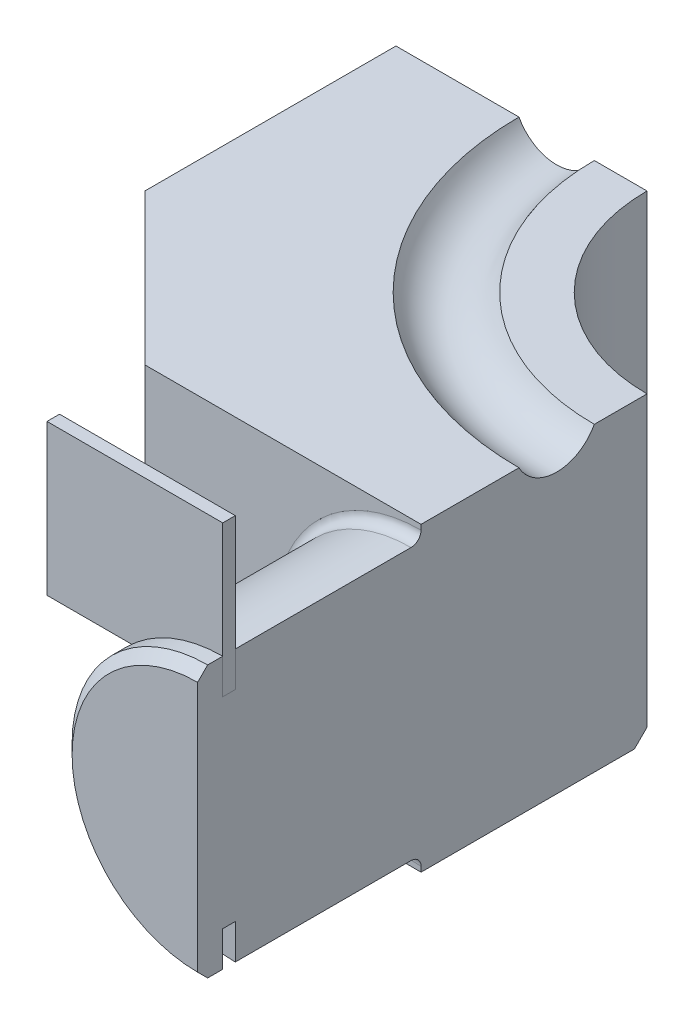
ISO-10303-21;
HEADER;
FILE_DESCRIPTION(('STEP AP214'),'2;1');
FILE_NAME('part.step','',(''),(''),'','','');
FILE_SCHEMA(('AUTOMOTIVE_DESIGN { 1 0 10303 214 1 1 1 1 }'));
ENDSEC;
DATA;
#1=APPLICATION_CONTEXT('core data for automotive mechanical design processes');
#2=APPLICATION_PROTOCOL_DEFINITION('international standard','automotive_design',2000,#1);
#3=PRODUCT_CONTEXT('',#1,'mechanical');
#4=PRODUCT('Part','Part','',(#3));
#5=PRODUCT_RELATED_PRODUCT_CATEGORY('part','',(#4));
#6=PRODUCT_DEFINITION_FORMATION('','',#4);
#7=PRODUCT_DEFINITION_CONTEXT('part definition',#1,'design');
#8=PRODUCT_DEFINITION('design','',#6,#7);
#9=PRODUCT_DEFINITION_SHAPE('','',#8);
#10=(LENGTH_UNIT() NAMED_UNIT(*) SI_UNIT(.MILLI.,.METRE.));
#11=(NAMED_UNIT(*) PLANE_ANGLE_UNIT() SI_UNIT($,.RADIAN.));
#12=(NAMED_UNIT(*) SI_UNIT($,.STERADIAN.) SOLID_ANGLE_UNIT());
#13=UNCERTAINTY_MEASURE_WITH_UNIT(LENGTH_MEASURE(1.E-05),#10,'distance_accuracy_value','');
#14=(GEOMETRIC_REPRESENTATION_CONTEXT(3) GLOBAL_UNCERTAINTY_ASSIGNED_CONTEXT((#13)) GLOBAL_UNIT_ASSIGNED_CONTEXT((#10,
#11,#12)) REPRESENTATION_CONTEXT('',''));
#15=CARTESIAN_POINT('',(0.,0.,0.));
#16=DIRECTION('',(0.,0.,1.));
#17=DIRECTION('',(1.,0.,0.));
#18=AXIS2_PLACEMENT_3D('',#15,#16,#17);
#19=CARTESIAN_POINT('',(0.,100.,239.));
#20=DIRECTION('',(0.,1.,0.));
#21=DIRECTION('',(0.,0.,1.));
#22=AXIS2_PLACEMENT_3D('',#19,#20,#21);
#23=PLANE('',#22);
#24=DIRECTION('',(1.,0.,0.));
#25=VECTOR('',#24,1.);
#26=CARTESIAN_POINT('',(0.,100.,234.));
#27=LINE('',#26,#25);
#28=CARTESIAN_POINT('',(-70.0000000000001,100.,234.));
#29=VERTEX_POINT('',#28);
#30=CARTESIAN_POINT('',(0.,100.,234.));
#31=VERTEX_POINT('',#30);
#32=EDGE_CURVE('E99',#29,#31,#27,.T.);
#33=ORIENTED_EDGE('',*,*,#32,.T.);
#34=DIRECTION('',(0.,0.,1.));
#35=VECTOR('',#34,1.);
#36=CARTESIAN_POINT('',(0.,100.,239.));
#37=LINE('',#36,#35);
#38=CARTESIAN_POINT('',(0.,100.,239.));
#39=VERTEX_POINT('',#38);
#40=EDGE_CURVE('E67',#31,#39,#37,.T.);
#41=ORIENTED_EDGE('',*,*,#40,.T.);
#42=DIRECTION('',(1.,0.,0.));
#43=VECTOR('',#42,1.);
#44=CARTESIAN_POINT('',(0.,100.,239.));
#45=LINE('',#44,#43);
#46=CARTESIAN_POINT('',(-70.0000000000001,100.,239.));
#47=VERTEX_POINT('',#46);
#48=EDGE_CURVE('E98',#47,#39,#45,.T.);
#49=ORIENTED_EDGE('',*,*,#48,.F.);
#50=DIRECTION('',(0.,0.,-1.));
#51=VECTOR('',#50,1.);
#52=CARTESIAN_POINT('',(-70.0000000000001,100.,239.));
#53=LINE('',#52,#51);
#54=EDGE_CURVE('E107',#47,#29,#53,.T.);
#55=ORIENTED_EDGE('',*,*,#54,.T.);
#56=EDGE_LOOP('',(#33,#41,#49,#55));
#57=FACE_BOUND('',#56,.T.);
#58=ADVANCED_FACE('F53',(#57),#23,.F.);
#59=CARTESIAN_POINT('',(0.,160.,239.));
#60=DIRECTION('',(0.,-1.,0.));
#61=DIRECTION('',(0.,0.,-1.));
#62=AXIS2_PLACEMENT_3D('',#59,#60,#61);
#63=PLANE('',#62);
#64=DIRECTION('',(-1.,0.,0.));
#65=VECTOR('',#64,1.);
#66=CARTESIAN_POINT('',(0.,160.,239.));
#67=LINE('',#66,#65);
#68=CARTESIAN_POINT('',(0.,160.,239.));
#69=VERTEX_POINT('',#68);
#70=CARTESIAN_POINT('',(-70.0000000000001,160.,239.));
#71=VERTEX_POINT('',#70);
#72=EDGE_CURVE('E60',#69,#71,#67,.T.);
#73=ORIENTED_EDGE('',*,*,#72,.F.);
#74=DIRECTION('',(0.,0.,-1.));
#75=VECTOR('',#74,1.);
#76=CARTESIAN_POINT('',(0.,160.,239.));
#77=LINE('',#76,#75);
#78=CARTESIAN_POINT('',(0.,160.,234.));
#79=VERTEX_POINT('',#78);
#80=EDGE_CURVE('E95',#69,#79,#77,.T.);
#81=ORIENTED_EDGE('',*,*,#80,.T.);
#82=DIRECTION('',(-1.,0.,0.));
#83=VECTOR('',#82,1.);
#84=CARTESIAN_POINT('',(0.,160.,234.));
#85=LINE('',#84,#83);
#86=CARTESIAN_POINT('',(-70.0000000000001,160.,234.));
#87=VERTEX_POINT('',#86);
#88=EDGE_CURVE('E88',#79,#87,#85,.T.);
#89=ORIENTED_EDGE('',*,*,#88,.T.);
#90=DIRECTION('',(0.,0.,-1.));
#91=VECTOR('',#90,1.);
#92=CARTESIAN_POINT('',(-70.0000000000001,160.,239.));
#93=LINE('',#92,#91);
#94=EDGE_CURVE('E91',#71,#87,#93,.T.);
#95=ORIENTED_EDGE('',*,*,#94,.F.);
#96=EDGE_LOOP('',(#73,#81,#89,#95));
#97=FACE_BOUND('',#96,.T.);
#98=ADVANCED_FACE('F90',(#97),#63,.F.);
#99=CARTESIAN_POINT('',(0.,0.,239.));
#100=DIRECTION('',(0.,0.,1.));
#101=DIRECTION('',(1.,0.,0.));
#102=AXIS2_PLACEMENT_3D('',#99,#100,#101);
#103=PLANE('',#102);
#104=DIRECTION('',(0.,-1.,0.));
#105=VECTOR('',#104,1.);
#106=CARTESIAN_POINT('',(0.,0.,239.));
#107=LINE('',#106,#105);
#108=EDGE_CURVE('E111',#69,#39,#107,.T.);
#109=ORIENTED_EDGE('',*,*,#108,.F.);
#110=ORIENTED_EDGE('',*,*,#72,.T.);
#111=DIRECTION('',(0.,1.,0.));
#112=VECTOR('',#111,1.);
#113=CARTESIAN_POINT('',(-70.0000000000001,160.,239.));
#114=LINE('',#113,#112);
#115=EDGE_CURVE('E106',#47,#71,#114,.T.);
#116=ORIENTED_EDGE('',*,*,#115,.F.);
#117=ORIENTED_EDGE('',*,*,#48,.T.);
#118=EDGE_LOOP('',(#109,#110,#116,#117));
#119=FACE_BOUND('',#118,.T.);
#120=ADVANCED_FACE('F121',(#119),#103,.T.);
#121=CARTESIAN_POINT('',(0.,0.,234.));
#122=DIRECTION('',(0.,0.,1.));
#123=DIRECTION('',(1.,0.,0.));
#124=AXIS2_PLACEMENT_3D('',#121,#122,#123);
#125=PLANE('',#124);
#126=ORIENTED_EDGE('',*,*,#88,.F.);
#127=DIRECTION('',(0.,-1.,0.));
#128=VECTOR('',#127,1.);
#129=CARTESIAN_POINT('',(0.,0.,234.));
#130=LINE('',#129,#128);
#131=EDGE_CURVE('E12',#79,#31,#130,.T.);
#132=ORIENTED_EDGE('',*,*,#131,.T.);
#133=ORIENTED_EDGE('',*,*,#32,.F.);
#134=DIRECTION('',(0.,1.,0.));
#135=VECTOR('',#134,1.);
#136=CARTESIAN_POINT('',(-70.0000000000001,160.,234.));
#137=LINE('',#136,#135);
#138=EDGE_CURVE('E104',#29,#87,#137,.T.);
#139=ORIENTED_EDGE('',*,*,#138,.T.);
#140=EDGE_LOOP('',(#126,#132,#133,#139));
#141=FACE_BOUND('',#140,.T.);
#142=ADVANCED_FACE('F109',(#141),#125,.F.);
#143=CARTESIAN_POINT('',(-70.0000000000001,160.,239.));
#144=DIRECTION('',(1.,0.,0.));
#145=DIRECTION('',(0.,-1.,0.));
#146=AXIS2_PLACEMENT_3D('',#143,#144,#145);
#147=PLANE('',#146);
#148=ORIENTED_EDGE('',*,*,#138,.F.);
#149=ORIENTED_EDGE('',*,*,#54,.F.);
#150=ORIENTED_EDGE('',*,*,#115,.T.);
#151=ORIENTED_EDGE('',*,*,#94,.T.);
#152=EDGE_LOOP('',(#148,#149,#150,#151));
#153=FACE_BOUND('',#152,.T.);
#154=ADVANCED_FACE('F102',(#153),#147,.F.);
#155=CARTESIAN_POINT('',(0.,209.166309537636,116.));
#156=DIRECTION('',(-1.,0.,0.));
#157=DIRECTION('',(0.,-1.,0.));
#158=AXIS2_PLACEMENT_3D('',#155,#156,#157);
#159=PLANE('',#158);
#160=ORIENTED_EDGE('',*,*,#108,.T.);
#161=ORIENTED_EDGE('',*,*,#40,.F.);
#162=ORIENTED_EDGE('',*,*,#131,.F.);
#163=ORIENTED_EDGE('',*,*,#80,.F.);
#164=EDGE_LOOP('',(#160,#161,#162,#163));
#165=FACE_BOUND('',#164,.T.);
#166=ADVANCED_FACE('F159',(#165),#159,.F.);
#167=CLOSED_SHELL('',(#58,#98,#120,#142,#154,#166));
#168=MANIFOLD_SOLID_BREP('B2',#167);
#169=CARTESIAN_POINT('',(0.,120.,0.));
#170=DIRECTION('',(0.,1.,0.));
#171=DIRECTION('',(0.,0.,1.));
#172=AXIS2_PLACEMENT_3D('',#169,#170,#171);
#173=PLANE('',#172);
#174=CARTESIAN_POINT('',(0.,120.,0.));
#175=DIRECTION('',(0.,1.,0.));
#176=DIRECTION('',(0.,0.,1.));
#177=AXIS2_PLACEMENT_3D('',#174,#175,#176);
#178=CIRCLE('',#177,121.);
#179=CARTESIAN_POINT('',(0.,120.,121.));
#180=VERTEX_POINT('',#179);
#181=CARTESIAN_POINT('',(-121.,120.,0.));
#182=VERTEX_POINT('',#181);
#183=EDGE_CURVE('E355',#180,#182,#178,.F.);
#184=ORIENTED_EDGE('',*,*,#183,.T.);
#185=DIRECTION('',(-1.,0.,0.));
#186=VECTOR('',#185,1.);
#187=CARTESIAN_POINT('',(0.,120.,0.));
#188=LINE('',#187,#186);
#189=CARTESIAN_POINT('',(-170.,120.,0.));
#190=VERTEX_POINT('',#189);
#191=EDGE_CURVE('E217',#182,#190,#188,.T.);
#192=ORIENTED_EDGE('',*,*,#191,.T.);
#193=DIRECTION('',(0.,0.,1.));
#194=VECTOR('',#193,1.);
#195=CARTESIAN_POINT('',(-170.,120.,-100.000000000001));
#196=LINE('',#195,#194);
#197=CARTESIAN_POINT('',(-170.,120.,100.000000000001));
#198=VERTEX_POINT('',#197);
#199=EDGE_CURVE('E397',#190,#198,#196,.T.);
#200=ORIENTED_EDGE('',*,*,#199,.T.);
#201=DIRECTION('',(0.707106781186552,0.,0.707106781186544));
#202=VECTOR('',#201,1.);
#203=CARTESIAN_POINT('',(-110.,120.,160.));
#204=LINE('',#203,#202);
#205=CARTESIAN_POINT('',(-110.,120.,160.));
#206=VERTEX_POINT('',#205);
#207=EDGE_CURVE('E399',#198,#206,#204,.T.);
#208=ORIENTED_EDGE('',*,*,#207,.T.);
#209=DIRECTION('',(1.,0.,0.));
#210=VECTOR('',#209,1.);
#211=CARTESIAN_POINT('',(-110.,120.,160.));
#212=LINE('',#211,#210);
#213=CARTESIAN_POINT('',(0.,120.,160.));
#214=VERTEX_POINT('',#213);
#215=EDGE_CURVE('E402',#206,#214,#212,.T.);
#216=ORIENTED_EDGE('',*,*,#215,.T.);
#217=DIRECTION('',(0.,0.,-1.));
#218=VECTOR('',#217,1.);
#219=CARTESIAN_POINT('',(0.,120.,0.));
#220=LINE('',#219,#218);
#221=EDGE_CURVE('E647',#214,#180,#220,.T.);
#222=ORIENTED_EDGE('',*,*,#221,.T.);
#223=EDGE_LOOP('',(#184,#192,#200,#208,#216,#222));
#224=FACE_BOUND('',#223,.T.);
#225=ADVANCED_FACE('F189',(#224),#173,.T.);
#226=CARTESIAN_POINT('',(0.,120.,0.));
#227=DIRECTION('',(0.,1.,0.));
#228=DIRECTION('',(0.,0.,1.));
#229=AXIS2_PLACEMENT_3D('',#226,#227,#228);
#230=CIRCLE('',#229,70.);
#231=CARTESIAN_POINT('',(-70.,120.,0.));
#232=VERTEX_POINT('',#231);
#233=CARTESIAN_POINT('',(0.,120.,70.));
#234=VERTEX_POINT('',#233);
#235=EDGE_CURVE('E370',#232,#234,#230,.T.);
#236=ORIENTED_EDGE('',*,*,#235,.F.);
#237=DIRECTION('',(-1.,0.,0.));
#238=VECTOR('',#237,1.);
#239=CARTESIAN_POINT('',(0.,120.,0.));
#240=LINE('',#239,#238);
#241=CARTESIAN_POINT('',(-91.,120.,0.));
#242=VERTEX_POINT('',#241);
#243=EDGE_CURVE('E369',#232,#242,#240,.T.);
#244=ORIENTED_EDGE('',*,*,#243,.T.);
#245=CARTESIAN_POINT('',(0.,120.,0.));
#246=DIRECTION('',(0.,-1.,0.));
#247=DIRECTION('',(0.,0.,-1.));
#248=AXIS2_PLACEMENT_3D('',#245,#246,#247);
#249=CIRCLE('',#248,91.);
#250=CARTESIAN_POINT('',(0.,120.,91.));
#251=VERTEX_POINT('',#250);
#252=EDGE_CURVE('E352',#242,#251,#249,.F.);
#253=ORIENTED_EDGE('',*,*,#252,.T.);
#254=DIRECTION('',(0.,0.,-1.));
#255=VECTOR('',#254,1.);
#256=CARTESIAN_POINT('',(0.,120.,0.));
#257=LINE('',#256,#255);
#258=EDGE_CURVE('E207',#251,#234,#257,.T.);
#259=ORIENTED_EDGE('',*,*,#258,.T.);
#260=EDGE_LOOP('',(#236,#244,#253,#259));
#261=FACE_BOUND('',#260,.T.);
#262=ADVANCED_FACE('F367',(#261),#173,.T.);
#263=CARTESIAN_POINT('',(-170.,120.,-100.000000000001));
#264=DIRECTION('',(1.,0.,0.));
#265=DIRECTION('',(0.,0.,-1.));
#266=AXIS2_PLACEMENT_3D('',#263,#264,#265);
#267=PLANE('',#266);
#268=DIRECTION('',(0.,1.,0.));
#269=VECTOR('',#268,1.);
#270=CARTESIAN_POINT('',(-170.,120.,0.));
#271=LINE('',#270,#269);
#272=CARTESIAN_POINT('',(-170.,0.,0.));
#273=VERTEX_POINT('',#272);
#274=EDGE_CURVE('E381',#273,#190,#271,.T.);
#275=ORIENTED_EDGE('',*,*,#274,.F.);
#276=DIRECTION('',(0.,0.,1.));
#277=VECTOR('',#276,1.);
#278=CARTESIAN_POINT('',(-170.,0.,-100.000000000001));
#279=LINE('',#278,#277);
#280=CARTESIAN_POINT('',(-170.,0.,100.000000000001));
#281=VERTEX_POINT('',#280);
#282=EDGE_CURVE('E396',#273,#281,#279,.T.);
#283=ORIENTED_EDGE('',*,*,#282,.T.);
#284=DIRECTION('',(0.,-1.,0.));
#285=VECTOR('',#284,1.);
#286=CARTESIAN_POINT('',(-170.,120.,100.000000000001));
#287=LINE('',#286,#285);
#288=EDGE_CURVE('E412',#198,#281,#287,.T.);
#289=ORIENTED_EDGE('',*,*,#288,.F.);
#290=ORIENTED_EDGE('',*,*,#199,.F.);
#291=EDGE_LOOP('',(#275,#283,#289,#290));
#292=FACE_BOUND('',#291,.T.);
#293=ADVANCED_FACE('F502',(#292),#267,.F.);
#294=CARTESIAN_POINT('',(-110.,120.,160.));
#295=DIRECTION('',(0.,0.,-1.));
#296=DIRECTION('',(-1.,0.,0.));
#297=AXIS2_PLACEMENT_3D('',#294,#295,#296);
#298=PLANE('',#297);
#299=DIRECTION('',(0.,-1.,0.));
#300=VECTOR('',#299,1.);
#301=CARTESIAN_POINT('',(0.,120.,160.));
#302=LINE('',#301,#300);
#303=CARTESIAN_POINT('',(0.,118.,160.));
#304=VERTEX_POINT('',#303);
#305=EDGE_CURVE('E339',#214,#304,#302,.T.);
#306=ORIENTED_EDGE('',*,*,#305,.F.);
#307=ORIENTED_EDGE('',*,*,#215,.F.);
#308=DIRECTION('',(0.,-1.,0.));
#309=VECTOR('',#308,1.);
#310=CARTESIAN_POINT('',(-110.,120.,160.));
#311=LINE('',#310,#309);
#312=CARTESIAN_POINT('',(-110.,0.,160.));
#313=VERTEX_POINT('',#312);
#314=EDGE_CURVE('E405',#206,#313,#311,.T.);
#315=ORIENTED_EDGE('',*,*,#314,.T.);
#316=DIRECTION('',(1.,0.,0.));
#317=VECTOR('',#316,1.);
#318=CARTESIAN_POINT('',(-110.,0.,160.));
#319=LINE('',#318,#317);
#320=CARTESIAN_POINT('',(0.,0.,160.));
#321=VERTEX_POINT('',#320);
#322=EDGE_CURVE('E400',#313,#321,#319,.T.);
#323=ORIENTED_EDGE('',*,*,#322,.T.);
#324=CARTESIAN_POINT('',(0.,2.,160.));
#325=VERTEX_POINT('',#324);
#326=EDGE_CURVE('E324',#325,#321,#302,.T.);
#327=ORIENTED_EDGE('',*,*,#326,.F.);
#328=CARTESIAN_POINT('',(0.,60.,160.));
#329=DIRECTION('',(0.,0.,-1.));
#330=DIRECTION('',(-1.,0.,0.));
#331=AXIS2_PLACEMENT_3D('',#328,#329,#330);
#332=CIRCLE('',#331,58.);
#333=EDGE_CURVE('E348',#325,#304,#332,.T.);
#334=ORIENTED_EDGE('',*,*,#333,.T.);
#335=EDGE_LOOP('',(#306,#307,#315,#323,#327,#334));
#336=FACE_BOUND('',#335,.T.);
#337=ADVANCED_FACE('F424',(#336),#298,.F.);
#338=CARTESIAN_POINT('',(0.,0.,0.));
#339=DIRECTION('',(0.,1.,0.));
#340=DIRECTION('',(0.,0.,1.));
#341=AXIS2_PLACEMENT_3D('',#338,#339,#340);
#342=PLANE('',#341);
#343=DIRECTION('',(1.,0.,0.));
#344=VECTOR('',#343,1.);
#345=CARTESIAN_POINT('',(-270.447334936307,0.,0.));
#346=LINE('',#345,#344);
#347=CARTESIAN_POINT('',(-75.0000000000001,0.,0.));
#348=VERTEX_POINT('',#347);
#349=EDGE_CURVE('E329',#273,#348,#346,.T.);
#350=ORIENTED_EDGE('',*,*,#349,.T.);
#351=CARTESIAN_POINT('',(0.,0.,0.));
#352=DIRECTION('',(0.,1.,0.));
#353=DIRECTION('',(0.,0.,1.));
#354=AXIS2_PLACEMENT_3D('',#351,#352,#353);
#355=CIRCLE('',#354,75.0000000000001);
#356=CARTESIAN_POINT('',(0.,0.,75.0000000000002));
#357=VERTEX_POINT('',#356);
#358=EDGE_CURVE('E335',#348,#357,#355,.T.);
#359=ORIENTED_EDGE('',*,*,#358,.T.);
#360=DIRECTION('',(0.,0.,1.));
#361=VECTOR('',#360,1.);
#362=CARTESIAN_POINT('',(0.,0.,331.159639247816));
#363=LINE('',#362,#361);
#364=EDGE_CURVE('E318',#357,#321,#363,.T.);
#365=ORIENTED_EDGE('',*,*,#364,.T.);
#366=ORIENTED_EDGE('',*,*,#322,.F.);
#367=DIRECTION('',(0.707106781186552,0.,0.707106781186544));
#368=VECTOR('',#367,1.);
#369=CARTESIAN_POINT('',(-110.,0.,160.));
#370=LINE('',#369,#368);
#371=EDGE_CURVE('E407',#281,#313,#370,.T.);
#372=ORIENTED_EDGE('',*,*,#371,.F.);
#373=ORIENTED_EDGE('',*,*,#282,.F.);
#374=EDGE_LOOP('',(#350,#359,#365,#366,#372,#373));
#375=FACE_BOUND('',#374,.T.);
#376=ADVANCED_FACE('F342',(#375),#342,.F.);
#377=CARTESIAN_POINT('',(0.,120.,0.));
#378=DIRECTION('',(0.,-1.,0.));
#379=DIRECTION('',(0.,0.,-1.));
#380=AXIS2_PLACEMENT_3D('',#377,#378,#379);
#381=CYLINDRICAL_SURFACE('',#380,70.);
#382=CARTESIAN_POINT('',(0.,5.00000000000006,0.));
#383=DIRECTION('',(0.,1.,0.));
#384=DIRECTION('',(0.,0.,1.));
#385=AXIS2_PLACEMENT_3D('',#382,#383,#384);
#386=CIRCLE('',#385,70.);
#387=CARTESIAN_POINT('',(0.,5.00000000000006,70.));
#388=VERTEX_POINT('',#387);
#389=CARTESIAN_POINT('',(-70.,5.00000000000006,0.));
#390=VERTEX_POINT('',#389);
#391=EDGE_CURVE('E337',#388,#390,#386,.F.);
#392=ORIENTED_EDGE('',*,*,#391,.T.);
#393=DIRECTION('',(0.,-1.,0.));
#394=VECTOR('',#393,1.);
#395=CARTESIAN_POINT('',(-70.,120.,0.));
#396=LINE('',#395,#394);
#397=EDGE_CURVE('E373',#390,#232,#396,.F.);
#398=ORIENTED_EDGE('',*,*,#397,.T.);
#399=ORIENTED_EDGE('',*,*,#235,.T.);
#400=DIRECTION('',(0.,-1.,0.));
#401=VECTOR('',#400,1.);
#402=CARTESIAN_POINT('',(0.,120.,70.));
#403=LINE('',#402,#401);
#404=EDGE_CURVE('E646',#234,#388,#403,.T.);
#405=ORIENTED_EDGE('',*,*,#404,.T.);
#406=EDGE_LOOP('',(#392,#398,#399,#405));
#407=FACE_BOUND('',#406,.T.);
#408=ADVANCED_FACE('F505',(#407),#381,.F.);
#409=CARTESIAN_POINT('',(0.,60.,234.));
#410=DIRECTION('',(0.,0.,-1.));
#411=DIRECTION('',(-1.,0.,0.));
#412=AXIS2_PLACEMENT_3D('',#409,#410,#411);
#413=CYLINDRICAL_SURFACE('',#412,54.);
#414=CARTESIAN_POINT('',(0.,60.,164.));
#415=DIRECTION('',(0.,0.,-1.));
#416=DIRECTION('',(-1.,0.,0.));
#417=AXIS2_PLACEMENT_3D('',#414,#415,#416);
#418=CIRCLE('',#417,54.);
#419=CARTESIAN_POINT('',(0.,114.,164.));
#420=VERTEX_POINT('',#419);
#421=CARTESIAN_POINT('',(0.,6.,164.));
#422=VERTEX_POINT('',#421);
#423=EDGE_CURVE('E344',#420,#422,#418,.F.);
#424=ORIENTED_EDGE('',*,*,#423,.T.);
#425=DIRECTION('',(0.,0.,-1.));
#426=VECTOR('',#425,1.);
#427=CARTESIAN_POINT('',(0.,6.,234.));
#428=LINE('',#427,#426);
#429=CARTESIAN_POINT('',(0.,6.,234.));
#430=VERTEX_POINT('',#429);
#431=EDGE_CURVE('E462',#422,#430,#428,.F.);
#432=ORIENTED_EDGE('',*,*,#431,.T.);
#433=CARTESIAN_POINT('',(0.,60.,234.));
#434=DIRECTION('',(0.,0.,-1.));
#435=DIRECTION('',(-1.,0.,0.));
#436=AXIS2_PLACEMENT_3D('',#433,#434,#435);
#437=CIRCLE('',#436,54.);
#438=CARTESIAN_POINT('',(0.,114.,234.));
#439=VERTEX_POINT('',#438);
#440=EDGE_CURVE('E392',#430,#439,#437,.T.);
#441=ORIENTED_EDGE('',*,*,#440,.T.);
#442=DIRECTION('',(0.,0.,-1.));
#443=VECTOR('',#442,1.);
#444=CARTESIAN_POINT('',(0.,114.,234.));
#445=LINE('',#444,#443);
#446=EDGE_CURVE('E432',#439,#420,#445,.T.);
#447=ORIENTED_EDGE('',*,*,#446,.T.);
#448=EDGE_LOOP('',(#424,#432,#441,#447));
#449=FACE_BOUND('',#448,.T.);
#450=ADVANCED_FACE('F578',(#449),#413,.T.);
#451=CARTESIAN_POINT('',(0.,60.,234.));
#452=DIRECTION('',(0.,0.,-1.));
#453=DIRECTION('',(-1.,0.,0.));
#454=AXIS2_PLACEMENT_3D('',#451,#452,#453);
#455=PLANE('',#454);
#456=DIRECTION('',(0.,-1.,0.));
#457=VECTOR('',#456,1.);
#458=CARTESIAN_POINT('',(0.,60.,234.));
#459=LINE('',#458,#457);
#460=CARTESIAN_POINT('',(0.,100.,234.));
#461=VERTEX_POINT('',#460);
#462=EDGE_CURVE('E434',#439,#461,#459,.T.);
#463=ORIENTED_EDGE('',*,*,#462,.F.);
#464=ORIENTED_EDGE('',*,*,#440,.F.);
#465=CARTESIAN_POINT('',(0.,20.,234.));
#466=VERTEX_POINT('',#465);
#467=EDGE_CURVE('E439',#466,#430,#459,.T.);
#468=ORIENTED_EDGE('',*,*,#467,.F.);
#469=CARTESIAN_POINT('',(0.,60.,234.));
#470=DIRECTION('',(0.,0.,-1.));
#471=DIRECTION('',(-1.,0.,0.));
#472=AXIS2_PLACEMENT_3D('',#469,#470,#471);
#473=CIRCLE('',#472,40.);
#474=EDGE_CURVE('E389',#466,#461,#473,.T.);
#475=ORIENTED_EDGE('',*,*,#474,.T.);
#476=EDGE_LOOP('',(#463,#464,#468,#475));
#477=FACE_BOUND('',#476,.T.);
#478=ADVANCED_FACE('F470',(#477),#455,.F.);
#479=CARTESIAN_POINT('',(0.,60.,239.));
#480=DIRECTION('',(0.,0.,-1.));
#481=DIRECTION('',(-1.,0.,0.));
#482=AXIS2_PLACEMENT_3D('',#479,#480,#481);
#483=CYLINDRICAL_SURFACE('',#482,40.);
#484=ORIENTED_EDGE('',*,*,#474,.F.);
#485=DIRECTION('',(0.,0.,-1.));
#486=VECTOR('',#485,1.);
#487=CARTESIAN_POINT('',(0.,20.,239.));
#488=LINE('',#487,#486);
#489=CARTESIAN_POINT('',(0.,20.,239.));
#490=VERTEX_POINT('',#489);
#491=EDGE_CURVE('E460',#466,#490,#488,.F.);
#492=ORIENTED_EDGE('',*,*,#491,.T.);
#493=CARTESIAN_POINT('',(0.,60.,239.));
#494=DIRECTION('',(0.,0.,-1.));
#495=DIRECTION('',(-1.,0.,0.));
#496=AXIS2_PLACEMENT_3D('',#493,#494,#495);
#497=CIRCLE('',#496,40.);
#498=CARTESIAN_POINT('',(0.,100.,239.));
#499=VERTEX_POINT('',#498);
#500=EDGE_CURVE('E386',#490,#499,#497,.T.);
#501=ORIENTED_EDGE('',*,*,#500,.T.);
#502=DIRECTION('',(0.,0.,-1.));
#503=VECTOR('',#502,1.);
#504=CARTESIAN_POINT('',(0.,100.,239.));
#505=LINE('',#504,#503);
#506=EDGE_CURVE('E438',#499,#461,#505,.T.);
#507=ORIENTED_EDGE('',*,*,#506,.T.);
#508=EDGE_LOOP('',(#484,#492,#501,#507));
#509=FACE_BOUND('',#508,.T.);
#510=ADVANCED_FACE('F472',(#509),#483,.T.);
#511=CARTESIAN_POINT('',(0.,60.,249.));
#512=DIRECTION('',(0.,0.,-1.));
#513=DIRECTION('',(-1.,0.,0.));
#514=AXIS2_PLACEMENT_3D('',#511,#512,#513);
#515=CYLINDRICAL_SURFACE('',#514,54.);
#516=CARTESIAN_POINT('',(0.,60.,239.));
#517=DIRECTION('',(0.,0.,-1.));
#518=DIRECTION('',(-1.,0.,0.));
#519=AXIS2_PLACEMENT_3D('',#516,#517,#518);
#520=CIRCLE('',#519,54.);
#521=CARTESIAN_POINT('',(0.,6.,239.));
#522=VERTEX_POINT('',#521);
#523=CARTESIAN_POINT('',(0.,114.,239.));
#524=VERTEX_POINT('',#523);
#525=EDGE_CURVE('E358',#522,#524,#520,.T.);
#526=ORIENTED_EDGE('',*,*,#525,.F.);
#527=DIRECTION('',(0.,0.,-1.));
#528=VECTOR('',#527,1.);
#529=CARTESIAN_POINT('',(0.,6.,249.));
#530=LINE('',#529,#528);
#531=CARTESIAN_POINT('',(0.,6.00000000000001,245.));
#532=VERTEX_POINT('',#531);
#533=EDGE_CURVE('E457',#522,#532,#530,.F.);
#534=ORIENTED_EDGE('',*,*,#533,.T.);
#535=CARTESIAN_POINT('',(0.,60.,245.));
#536=DIRECTION('',(0.,0.,-1.));
#537=DIRECTION('',(-1.,0.,0.));
#538=AXIS2_PLACEMENT_3D('',#535,#536,#537);
#539=CIRCLE('',#538,54.);
#540=CARTESIAN_POINT('',(0.,114.,245.));
#541=VERTEX_POINT('',#540);
#542=EDGE_CURVE('E415',#532,#541,#539,.T.);
#543=ORIENTED_EDGE('',*,*,#542,.T.);
#544=DIRECTION('',(0.,0.,-1.));
#545=VECTOR('',#544,1.);
#546=CARTESIAN_POINT('',(0.,114.,249.));
#547=LINE('',#546,#545);
#548=EDGE_CURVE('E445',#541,#524,#547,.T.);
#549=ORIENTED_EDGE('',*,*,#548,.T.);
#550=EDGE_LOOP('',(#526,#534,#543,#549));
#551=FACE_BOUND('',#550,.T.);
#552=ADVANCED_FACE('F479',(#551),#515,.T.);
#553=CARTESIAN_POINT('',(0.,60.,249.));
#554=DIRECTION('',(0.,0.,-1.));
#555=DIRECTION('',(-1.,0.,0.));
#556=AXIS2_PLACEMENT_3D('',#553,#554,#555);
#557=PLANE('',#556);
#558=DIRECTION('',(0.,-1.,0.));
#559=VECTOR('',#558,1.);
#560=CARTESIAN_POINT('',(0.,60.,249.));
#561=LINE('',#560,#559);
#562=CARTESIAN_POINT('',(0.,110.,249.));
#563=VERTEX_POINT('',#562);
#564=CARTESIAN_POINT('',(0.,10.0000000000001,249.));
#565=VERTEX_POINT('',#564);
#566=EDGE_CURVE('E452',#563,#565,#561,.T.);
#567=ORIENTED_EDGE('',*,*,#566,.F.);
#568=CARTESIAN_POINT('',(0.,60.,249.));
#569=DIRECTION('',(0.,0.,-1.));
#570=DIRECTION('',(-1.,0.,0.));
#571=AXIS2_PLACEMENT_3D('',#568,#569,#570);
#572=CIRCLE('',#571,49.9999999999999);
#573=EDGE_CURVE('E418',#563,#565,#572,.F.);
#574=ORIENTED_EDGE('',*,*,#573,.T.);
#575=EDGE_LOOP('',(#567,#574));
#576=FACE_BOUND('',#575,.T.);
#577=ADVANCED_FACE('F486',(#576),#557,.F.);
#578=CARTESIAN_POINT('',(0.,60.,239.));
#579=DIRECTION('',(0.,0.,-1.));
#580=DIRECTION('',(-1.,0.,0.));
#581=AXIS2_PLACEMENT_3D('',#578,#579,#580);
#582=PLANE('',#581);
#583=ORIENTED_EDGE('',*,*,#525,.T.);
#584=DIRECTION('',(0.,-1.,0.));
#585=VECTOR('',#584,1.);
#586=CARTESIAN_POINT('',(0.,60.,239.));
#587=LINE('',#586,#585);
#588=EDGE_CURVE('E442',#524,#499,#587,.T.);
#589=ORIENTED_EDGE('',*,*,#588,.T.);
#590=ORIENTED_EDGE('',*,*,#500,.F.);
#591=EDGE_CURVE('E446',#490,#522,#587,.T.);
#592=ORIENTED_EDGE('',*,*,#591,.T.);
#593=EDGE_LOOP('',(#583,#589,#590,#592));
#594=FACE_BOUND('',#593,.T.);
#595=ADVANCED_FACE('F475',(#594),#582,.T.);
#596=CARTESIAN_POINT('',(0.,60.,245.));
#597=DIRECTION('',(0.,0.,-1.));
#598=DIRECTION('',(-1.,0.,0.));
#599=AXIS2_PLACEMENT_3D('',#596,#597,#598);
#600=CONICAL_SURFACE('',#599,54.,0.785398163397457);
#601=ORIENTED_EDGE('',*,*,#542,.F.);
#602=DIRECTION('',(0.,-0.707106781186554,-0.707106781186541));
#603=VECTOR('',#602,1.);
#604=CARTESIAN_POINT('',(0.,60.,298.999999999999));
#605=LINE('',#604,#603);
#606=EDGE_CURVE('E454',#532,#565,#605,.F.);
#607=ORIENTED_EDGE('',*,*,#606,.T.);
#608=ORIENTED_EDGE('',*,*,#573,.F.);
#609=DIRECTION('',(0.,-0.707106781186554,0.707106781186541));
#610=VECTOR('',#609,1.);
#611=CARTESIAN_POINT('',(0.,60.,298.999999999999));
#612=LINE('',#611,#610);
#613=EDGE_CURVE('E449',#563,#541,#612,.F.);
#614=ORIENTED_EDGE('',*,*,#613,.T.);
#615=EDGE_LOOP('',(#601,#607,#608,#614));
#616=FACE_BOUND('',#615,.T.);
#617=ADVANCED_FACE('F484',(#616),#600,.T.);
#618=CARTESIAN_POINT('',(0.,60.,164.));
#619=DIRECTION('',(0.,0.,-1.));
#620=DIRECTION('',(-1.,0.,0.));
#621=AXIS2_PLACEMENT_3D('',#618,#619,#620);
#622=TOROIDAL_SURFACE('',#621,58.,4.);
#623=CARTESIAN_POINT('',(0.,2.,164.));
#624=DIRECTION('',(1.,0.,0.));
#625=DIRECTION('',(0.,0.,-1.));
#626=AXIS2_PLACEMENT_3D('',#623,#624,#625);
#627=CIRCLE('',#626,4.);
#628=EDGE_CURVE('E375',#422,#325,#627,.F.);
#629=ORIENTED_EDGE('',*,*,#628,.F.);
#630=ORIENTED_EDGE('',*,*,#423,.F.);
#631=CARTESIAN_POINT('',(0.,118.,164.));
#632=DIRECTION('',(1.,0.,0.));
#633=DIRECTION('',(0.,0.,-1.));
#634=AXIS2_PLACEMENT_3D('',#631,#632,#633);
#635=CIRCLE('',#634,4.);
#636=EDGE_CURVE('E338',#304,#420,#635,.F.);
#637=ORIENTED_EDGE('',*,*,#636,.F.);
#638=ORIENTED_EDGE('',*,*,#333,.F.);
#639=EDGE_LOOP('',(#629,#630,#637,#638));
#640=FACE_BOUND('',#639,.T.);
#641=ADVANCED_FACE('F429',(#640),#622,.F.);
#642=CARTESIAN_POINT('',(0.,0.,0.));
#643=DIRECTION('',(0.,-1.,0.));
#644=DIRECTION('',(0.,0.,-1.));
#645=AXIS2_PLACEMENT_3D('',#642,#643,#644);
#646=CONICAL_SURFACE('',#645,75.0000000000001,0.785398163397452);
#647=ORIENTED_EDGE('',*,*,#358,.F.);
#648=DIRECTION('',(0.70710678118655,0.707106781186545,0.));
#649=VECTOR('',#648,1.);
#650=CARTESIAN_POINT('',(0.,74.9999999999995,0.));
#651=LINE('',#650,#649);
#652=EDGE_CURVE('E356',#348,#390,#651,.T.);
#653=ORIENTED_EDGE('',*,*,#652,.T.);
#654=ORIENTED_EDGE('',*,*,#391,.F.);
#655=DIRECTION('',(0.,-0.707106781186545,0.70710678118655));
#656=VECTOR('',#655,1.);
#657=CARTESIAN_POINT('',(0.,74.9999999999995,0.));
#658=LINE('',#657,#656);
#659=EDGE_CURVE('E321',#388,#357,#658,.T.);
#660=ORIENTED_EDGE('',*,*,#659,.T.);
#661=EDGE_LOOP('',(#647,#653,#654,#660));
#662=FACE_BOUND('',#661,.T.);
#663=ADVANCED_FACE('F191',(#662),#646,.F.);
#664=CARTESIAN_POINT('',(0.,128.,0.));
#665=DIRECTION('',(0.,1.,0.));
#666=DIRECTION('',(0.,0.,1.));
#667=AXIS2_PLACEMENT_3D('',#664,#665,#666);
#668=TOROIDAL_SURFACE('',#667,106.,17.);
#669=ORIENTED_EDGE('',*,*,#252,.F.);
#670=CARTESIAN_POINT('',(-106.,128.,0.));
#671=DIRECTION('',(0.,0.,-1.));
#672=DIRECTION('',(-1.,0.,0.));
#673=AXIS2_PLACEMENT_3D('',#670,#671,#672);
#674=CIRCLE('',#673,17.);
#675=EDGE_CURVE('E51',#242,#182,#674,.T.);
#676=ORIENTED_EDGE('',*,*,#675,.T.);
#677=ORIENTED_EDGE('',*,*,#183,.F.);
#678=CARTESIAN_POINT('',(0.,128.,106.));
#679=DIRECTION('',(1.,0.,0.));
#680=DIRECTION('',(0.,0.,-1.));
#681=AXIS2_PLACEMENT_3D('',#678,#679,#680);
#682=CIRCLE('',#681,17.);
#683=EDGE_CURVE('E197',#180,#251,#682,.T.);
#684=ORIENTED_EDGE('',*,*,#683,.T.);
#685=EDGE_LOOP('',(#669,#676,#677,#684));
#686=FACE_BOUND('',#685,.T.);
#687=ADVANCED_FACE('F362',(#686),#668,.F.);
#688=CARTESIAN_POINT('',(-110.,120.,160.));
#689=DIRECTION('',(0.707106781186544,0.,-0.707106781186551));
#690=DIRECTION('',(-0.707106781186551,0.,-0.707106781186544));
#691=AXIS2_PLACEMENT_3D('',#688,#689,#690);
#692=PLANE('',#691);
#693=ORIENTED_EDGE('',*,*,#371,.T.);
#694=ORIENTED_EDGE('',*,*,#314,.F.);
#695=ORIENTED_EDGE('',*,*,#207,.F.);
#696=ORIENTED_EDGE('',*,*,#288,.T.);
#697=EDGE_LOOP('',(#693,#694,#695,#696));
#698=FACE_BOUND('',#697,.T.);
#699=ADVANCED_FACE('F511',(#698),#692,.F.);
#700=CARTESIAN_POINT('',(0.,133.,331.159639247816));
#701=DIRECTION('',(1.,0.,0.));
#702=DIRECTION('',(0.,0.,-1.));
#703=AXIS2_PLACEMENT_3D('',#700,#701,#702);
#704=PLANE('',#703);
#705=ORIENTED_EDGE('',*,*,#326,.T.);
#706=ORIENTED_EDGE('',*,*,#364,.F.);
#707=ORIENTED_EDGE('',*,*,#659,.F.);
#708=ORIENTED_EDGE('',*,*,#404,.F.);
#709=ORIENTED_EDGE('',*,*,#258,.F.);
#710=ORIENTED_EDGE('',*,*,#683,.F.);
#711=ORIENTED_EDGE('',*,*,#221,.F.);
#712=ORIENTED_EDGE('',*,*,#305,.T.);
#713=ORIENTED_EDGE('',*,*,#636,.T.);
#714=ORIENTED_EDGE('',*,*,#446,.F.);
#715=ORIENTED_EDGE('',*,*,#462,.T.);
#716=ORIENTED_EDGE('',*,*,#506,.F.);
#717=ORIENTED_EDGE('',*,*,#588,.F.);
#718=ORIENTED_EDGE('',*,*,#548,.F.);
#719=ORIENTED_EDGE('',*,*,#613,.F.);
#720=ORIENTED_EDGE('',*,*,#566,.T.);
#721=ORIENTED_EDGE('',*,*,#606,.F.);
#722=ORIENTED_EDGE('',*,*,#533,.F.);
#723=ORIENTED_EDGE('',*,*,#591,.F.);
#724=ORIENTED_EDGE('',*,*,#491,.F.);
#725=ORIENTED_EDGE('',*,*,#467,.T.);
#726=ORIENTED_EDGE('',*,*,#431,.F.);
#727=ORIENTED_EDGE('',*,*,#628,.T.);
#728=EDGE_LOOP('',(#705,#706,#707,#708,#709,#710,#711,#712,#713,#714,#715,#716,#717,#718,#719,
#720,#721,#722,#723,#724,#725,#726,#727));
#729=FACE_BOUND('',#728,.T.);
#730=ADVANCED_FACE('F320',(#729),#704,.T.);
#731=CARTESIAN_POINT('',(-270.447334936307,133.,0.));
#732=DIRECTION('',(0.,0.,-1.));
#733=DIRECTION('',(-1.,0.,0.));
#734=AXIS2_PLACEMENT_3D('',#731,#732,#733);
#735=PLANE('',#734);
#736=ORIENTED_EDGE('',*,*,#349,.F.);
#737=ORIENTED_EDGE('',*,*,#274,.T.);
#738=ORIENTED_EDGE('',*,*,#191,.F.);
#739=ORIENTED_EDGE('',*,*,#675,.F.);
#740=ORIENTED_EDGE('',*,*,#243,.F.);
#741=ORIENTED_EDGE('',*,*,#397,.F.);
#742=ORIENTED_EDGE('',*,*,#652,.F.);
#743=EDGE_LOOP('',(#736,#737,#738,#739,#740,#741,#742));
#744=FACE_BOUND('',#743,.T.);
#745=ADVANCED_FACE('F529',(#744),#735,.T.);
#746=CLOSED_SHELL('',(#225,#262,#293,#337,#376,#408,#450,#478,#510,#552,#577,#595,#617,#641,
#663,#687,#699,#730,#745));
#747=MANIFOLD_SOLID_BREP('B6',#746);
#748=ADVANCED_BREP_SHAPE_REPRESENTATION('',(#18,#168,#747),#14);
#749=SHAPE_DEFINITION_REPRESENTATION(#9,#748);
ENDSEC;
END-ISO-10303-21;
